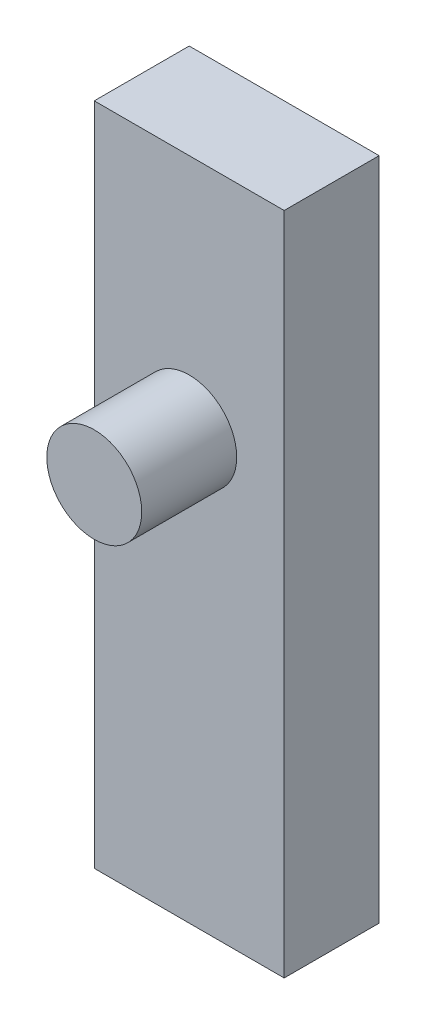
ISO-10303-21;
HEADER;
FILE_DESCRIPTION(('STEP AP214'),'2;1');
FILE_NAME('part.step','',(''),(''),'','','');
FILE_SCHEMA(('AUTOMOTIVE_DESIGN { 1 0 10303 214 1 1 1 1 }'));
ENDSEC;
DATA;
#1=APPLICATION_CONTEXT('core data for automotive mechanical design processes');
#2=APPLICATION_PROTOCOL_DEFINITION('international standard','automotive_design',2000,#1);
#3=PRODUCT_CONTEXT('',#1,'mechanical');
#4=PRODUCT('Part','Part','',(#3));
#5=PRODUCT_RELATED_PRODUCT_CATEGORY('part','',(#4));
#6=PRODUCT_DEFINITION_FORMATION('','',#4);
#7=PRODUCT_DEFINITION_CONTEXT('part definition',#1,'design');
#8=PRODUCT_DEFINITION('design','',#6,#7);
#9=PRODUCT_DEFINITION_SHAPE('','',#8);
#10=(LENGTH_UNIT() NAMED_UNIT(*) SI_UNIT(.MILLI.,.METRE.));
#11=(NAMED_UNIT(*) PLANE_ANGLE_UNIT() SI_UNIT($,.RADIAN.));
#12=(NAMED_UNIT(*) SI_UNIT($,.STERADIAN.) SOLID_ANGLE_UNIT());
#13=UNCERTAINTY_MEASURE_WITH_UNIT(LENGTH_MEASURE(1.E-05),#10,'distance_accuracy_value','');
#14=(GEOMETRIC_REPRESENTATION_CONTEXT(3) GLOBAL_UNCERTAINTY_ASSIGNED_CONTEXT((#13)) GLOBAL_UNIT_ASSIGNED_CONTEXT((#10,
#11,#12)) REPRESENTATION_CONTEXT('',''));
#15=CARTESIAN_POINT('',(0.,0.,0.));
#16=DIRECTION('',(0.,0.,1.));
#17=DIRECTION('',(1.,0.,0.));
#18=AXIS2_PLACEMENT_3D('',#15,#16,#17);
#19=CARTESIAN_POINT('',(0.,0.,10.));
#20=DIRECTION('',(1.,0.,0.));
#21=DIRECTION('',(0.,1.,0.));
#22=AXIS2_PLACEMENT_3D('',#19,#20,#21);
#23=PLANE('',#22);
#24=DIRECTION('',(0.,-1.,0.));
#25=VECTOR('',#24,1.);
#26=CARTESIAN_POINT('',(0.,0.,0.));
#27=LINE('',#26,#25);
#28=CARTESIAN_POINT('',(0.,0.,0.));
#29=VERTEX_POINT('',#28);
#30=CARTESIAN_POINT('',(0.,-70.,0.));
#31=VERTEX_POINT('',#30);
#32=EDGE_CURVE('E99',#29,#31,#27,.T.);
#33=ORIENTED_EDGE('',*,*,#32,.T.);
#34=DIRECTION('',(0.,0.,-1.));
#35=VECTOR('',#34,1.);
#36=CARTESIAN_POINT('',(0.,-70.,10.));
#37=LINE('',#36,#35);
#38=CARTESIAN_POINT('',(0.,-70.,10.));
#39=VERTEX_POINT('',#38);
#40=EDGE_CURVE('E11',#39,#31,#37,.T.);
#41=ORIENTED_EDGE('',*,*,#40,.F.);
#42=DIRECTION('',(0.,-1.,0.));
#43=VECTOR('',#42,1.);
#44=CARTESIAN_POINT('',(0.,0.,10.));
#45=LINE('',#44,#43);
#46=CARTESIAN_POINT('',(0.,0.,10.));
#47=VERTEX_POINT('',#46);
#48=EDGE_CURVE('E87',#47,#39,#45,.T.);
#49=ORIENTED_EDGE('',*,*,#48,.F.);
#50=DIRECTION('',(0.,0.,-1.));
#51=VECTOR('',#50,1.);
#52=CARTESIAN_POINT('',(0.,0.,10.));
#53=LINE('',#52,#51);
#54=EDGE_CURVE('E95',#47,#29,#53,.T.);
#55=ORIENTED_EDGE('',*,*,#54,.T.);
#56=EDGE_LOOP('',(#33,#41,#49,#55));
#57=FACE_BOUND('',#56,.T.);
#58=ADVANCED_FACE('F36',(#57),#23,.F.);
#59=CARTESIAN_POINT('',(0.,-70.,10.));
#60=DIRECTION('',(0.,1.,0.));
#61=DIRECTION('',(0.,0.,1.));
#62=AXIS2_PLACEMENT_3D('',#59,#60,#61);
#63=PLANE('',#62);
#64=DIRECTION('',(1.,0.,0.));
#65=VECTOR('',#64,1.);
#66=CARTESIAN_POINT('',(0.,-70.,0.));
#67=LINE('',#66,#65);
#68=CARTESIAN_POINT('',(20.,-70.,0.));
#69=VERTEX_POINT('',#68);
#70=EDGE_CURVE('E91',#31,#69,#67,.T.);
#71=ORIENTED_EDGE('',*,*,#70,.T.);
#72=DIRECTION('',(0.,0.,-1.));
#73=VECTOR('',#72,1.);
#74=CARTESIAN_POINT('',(20.,-70.,10.));
#75=LINE('',#74,#73);
#76=CARTESIAN_POINT('',(20.,-70.,10.));
#77=VERTEX_POINT('',#76);
#78=EDGE_CURVE('E44',#77,#69,#75,.T.);
#79=ORIENTED_EDGE('',*,*,#78,.F.);
#80=DIRECTION('',(1.,0.,0.));
#81=VECTOR('',#80,1.);
#82=CARTESIAN_POINT('',(0.,-70.,10.));
#83=LINE('',#82,#81);
#84=EDGE_CURVE('E82',#39,#77,#83,.T.);
#85=ORIENTED_EDGE('',*,*,#84,.F.);
#86=ORIENTED_EDGE('',*,*,#40,.T.);
#87=EDGE_LOOP('',(#71,#79,#85,#86));
#88=FACE_BOUND('',#87,.T.);
#89=ADVANCED_FACE('F90',(#88),#63,.F.);
#90=CARTESIAN_POINT('',(20.,0.,10.));
#91=DIRECTION('',(-1.,0.,0.));
#92=DIRECTION('',(0.,-1.,0.));
#93=AXIS2_PLACEMENT_3D('',#90,#91,#92);
#94=PLANE('',#93);
#95=DIRECTION('',(0.,1.,0.));
#96=VECTOR('',#95,1.);
#97=CARTESIAN_POINT('',(20.,0.,0.));
#98=LINE('',#97,#96);
#99=CARTESIAN_POINT('',(20.,0.,0.));
#100=VERTEX_POINT('',#99);
#101=EDGE_CURVE('E69',#69,#100,#98,.T.);
#102=ORIENTED_EDGE('',*,*,#101,.T.);
#103=DIRECTION('',(0.,0.,-1.));
#104=VECTOR('',#103,1.);
#105=CARTESIAN_POINT('',(20.,0.,10.));
#106=LINE('',#105,#104);
#107=CARTESIAN_POINT('',(20.,0.,10.));
#108=VERTEX_POINT('',#107);
#109=EDGE_CURVE('E92',#108,#100,#106,.T.);
#110=ORIENTED_EDGE('',*,*,#109,.F.);
#111=DIRECTION('',(0.,1.,0.));
#112=VECTOR('',#111,1.);
#113=CARTESIAN_POINT('',(20.,0.,10.));
#114=LINE('',#113,#112);
#115=EDGE_CURVE('E85',#77,#108,#114,.T.);
#116=ORIENTED_EDGE('',*,*,#115,.F.);
#117=ORIENTED_EDGE('',*,*,#78,.T.);
#118=EDGE_LOOP('',(#102,#110,#116,#117));
#119=FACE_BOUND('',#118,.T.);
#120=ADVANCED_FACE('F93',(#119),#94,.F.);
#121=CARTESIAN_POINT('',(0.,0.,10.));
#122=DIRECTION('',(0.,-1.,0.));
#123=DIRECTION('',(0.,0.,-1.));
#124=AXIS2_PLACEMENT_3D('',#121,#122,#123);
#125=PLANE('',#124);
#126=DIRECTION('',(-1.,0.,0.));
#127=VECTOR('',#126,1.);
#128=CARTESIAN_POINT('',(0.,0.,0.));
#129=LINE('',#128,#127);
#130=EDGE_CURVE('E75',#100,#29,#129,.T.);
#131=ORIENTED_EDGE('',*,*,#130,.T.);
#132=ORIENTED_EDGE('',*,*,#54,.F.);
#133=DIRECTION('',(-1.,0.,0.));
#134=VECTOR('',#133,1.);
#135=CARTESIAN_POINT('',(0.,0.,10.));
#136=LINE('',#135,#134);
#137=EDGE_CURVE('E52',#108,#47,#136,.T.);
#138=ORIENTED_EDGE('',*,*,#137,.F.);
#139=ORIENTED_EDGE('',*,*,#109,.T.);
#140=EDGE_LOOP('',(#131,#132,#138,#139));
#141=FACE_BOUND('',#140,.T.);
#142=ADVANCED_FACE('F107',(#141),#125,.F.);
#143=CARTESIAN_POINT('',(0.,0.,10.));
#144=DIRECTION('',(0.,0.,1.));
#145=DIRECTION('',(1.,0.,0.));
#146=AXIS2_PLACEMENT_3D('',#143,#144,#145);
#147=PLANE('',#146);
#148=CARTESIAN_POINT('',(10.,-25.,10.));
#149=DIRECTION('',(0.,0.,1.));
#150=DIRECTION('',(1.,0.,0.));
#151=AXIS2_PLACEMENT_3D('',#148,#149,#150);
#152=CIRCLE('',#151,5.);
#153=CARTESIAN_POINT('',(15.,-25.,10.));
#154=VERTEX_POINT('',#153);
#155=EDGE_CURVE('E113',#154,#154,#152,.T.);
#156=ORIENTED_EDGE('',*,*,#155,.F.);
#157=EDGE_LOOP('',(#156));
#158=FACE_BOUND('',#157,.T.);
#159=ORIENTED_EDGE('',*,*,#48,.T.);
#160=ORIENTED_EDGE('',*,*,#84,.T.);
#161=ORIENTED_EDGE('',*,*,#115,.T.);
#162=ORIENTED_EDGE('',*,*,#137,.T.);
#163=EDGE_LOOP('',(#159,#160,#161,#162));
#164=FACE_BOUND('',#163,.T.);
#165=ADVANCED_FACE('F83',(#158,#164),#147,.T.);
#166=CARTESIAN_POINT('',(0.,0.,0.));
#167=DIRECTION('',(0.,0.,1.));
#168=DIRECTION('',(1.,0.,0.));
#169=AXIS2_PLACEMENT_3D('',#166,#167,#168);
#170=PLANE('',#169);
#171=ORIENTED_EDGE('',*,*,#32,.F.);
#172=ORIENTED_EDGE('',*,*,#130,.F.);
#173=ORIENTED_EDGE('',*,*,#101,.F.);
#174=ORIENTED_EDGE('',*,*,#70,.F.);
#175=EDGE_LOOP('',(#171,#172,#173,#174));
#176=FACE_BOUND('',#175,.T.);
#177=ADVANCED_FACE('F110',(#176),#170,.F.);
#178=CARTESIAN_POINT('',(10.,-25.,20.));
#179=DIRECTION('',(0.,0.,-1.));
#180=DIRECTION('',(-1.,0.,0.));
#181=AXIS2_PLACEMENT_3D('',#178,#179,#180);
#182=CYLINDRICAL_SURFACE('',#181,5.);
#183=CARTESIAN_POINT('',(10.,-25.,20.));
#184=DIRECTION('',(0.,0.,1.));
#185=DIRECTION('',(1.,0.,0.));
#186=AXIS2_PLACEMENT_3D('',#183,#184,#185);
#187=CIRCLE('',#186,5.);
#188=CARTESIAN_POINT('',(15.,-25.,20.));
#189=VERTEX_POINT('',#188);
#190=EDGE_CURVE('E102',#189,#189,#187,.T.);
#191=ORIENTED_EDGE('',*,*,#190,.F.);
#192=EDGE_LOOP('',(#191));
#193=FACE_BOUND('',#192,.T.);
#194=ORIENTED_EDGE('',*,*,#155,.T.);
#195=EDGE_LOOP('',(#194));
#196=FACE_BOUND('',#195,.T.);
#197=ADVANCED_FACE('F121',(#193,#196),#182,.T.);
#198=CARTESIAN_POINT('',(10.,-25.,20.));
#199=DIRECTION('',(0.,0.,1.));
#200=DIRECTION('',(1.,0.,0.));
#201=AXIS2_PLACEMENT_3D('',#198,#199,#200);
#202=PLANE('',#201);
#203=ORIENTED_EDGE('',*,*,#190,.T.);
#204=EDGE_LOOP('',(#203));
#205=FACE_BOUND('',#204,.T.);
#206=ADVANCED_FACE('F119',(#205),#202,.T.);
#207=CLOSED_SHELL('',(#58,#89,#120,#142,#165,#177,#197,#206));
#208=MANIFOLD_SOLID_BREP('B2',#207);
#209=ADVANCED_BREP_SHAPE_REPRESENTATION('',(#18,#208),#14);
#210=SHAPE_DEFINITION_REPRESENTATION(#9,#209);
ENDSEC;
END-ISO-10303-21;
